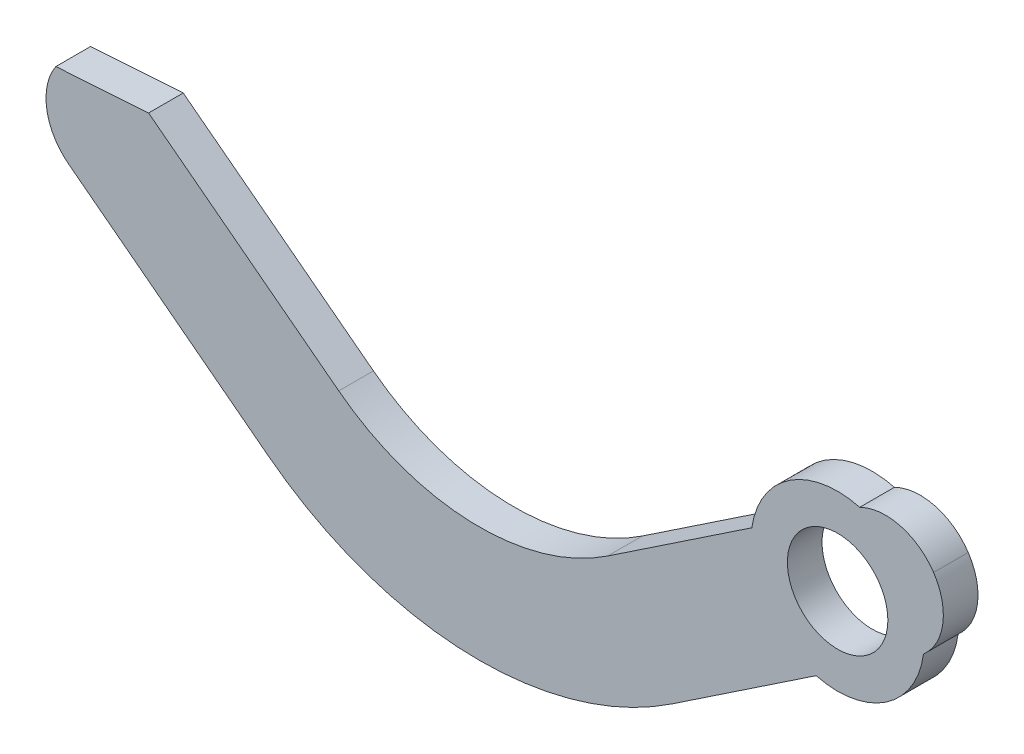
ISO-10303-21;
HEADER;
FILE_DESCRIPTION(('STEP AP214'),'2;1');
FILE_NAME('part.step','',(''),(''),'','','');
FILE_SCHEMA(('AUTOMOTIVE_DESIGN { 1 0 10303 214 1 1 1 1 }'));
ENDSEC;
DATA;
#1=APPLICATION_CONTEXT('core data for automotive mechanical design processes');
#2=APPLICATION_PROTOCOL_DEFINITION('international standard','automotive_design',2000,#1);
#3=PRODUCT_CONTEXT('',#1,'mechanical');
#4=PRODUCT('Part','Part','',(#3));
#5=PRODUCT_RELATED_PRODUCT_CATEGORY('part','',(#4));
#6=PRODUCT_DEFINITION_FORMATION('','',#4);
#7=PRODUCT_DEFINITION_CONTEXT('part definition',#1,'design');
#8=PRODUCT_DEFINITION('design','',#6,#7);
#9=PRODUCT_DEFINITION_SHAPE('','',#8);
#10=(LENGTH_UNIT() NAMED_UNIT(*) SI_UNIT(.MILLI.,.METRE.));
#11=(NAMED_UNIT(*) PLANE_ANGLE_UNIT() SI_UNIT($,.RADIAN.));
#12=(NAMED_UNIT(*) SI_UNIT($,.STERADIAN.) SOLID_ANGLE_UNIT());
#13=UNCERTAINTY_MEASURE_WITH_UNIT(LENGTH_MEASURE(1.E-05),#10,'distance_accuracy_value','');
#14=(GEOMETRIC_REPRESENTATION_CONTEXT(3) GLOBAL_UNCERTAINTY_ASSIGNED_CONTEXT((#13)) GLOBAL_UNIT_ASSIGNED_CONTEXT((#10,
#11,#12)) REPRESENTATION_CONTEXT('',''));
#15=CARTESIAN_POINT('',(0.,0.,0.));
#16=DIRECTION('',(0.,0.,1.));
#17=DIRECTION('',(1.,0.,0.));
#18=AXIS2_PLACEMENT_3D('',#15,#16,#17);
#19=CARTESIAN_POINT('',(-19.8730458213668,-25.3387015513863,3.));
#20=DIRECTION('',(-0.55631676865142,0.830970308084015,0.));
#21=DIRECTION('',(-0.830970308084015,-0.55631676865142,0.));
#22=AXIS2_PLACEMENT_3D('',#19,#20,#21);
#23=PLANE('',#22);
#24=DIRECTION('',(0.830970308084015,0.55631676865142,0.));
#25=VECTOR('',#24,1.);
#26=CARTESIAN_POINT('',(-19.8730458213668,-25.3387015513863,0.));
#27=LINE('',#26,#25);
#28=CARTESIAN_POINT('',(-19.8730458213668,-25.3387015513863,0.));
#29=VERTEX_POINT('',#28);
#30=CARTESIAN_POINT('',(-7.39180063472545,-16.9827760466733,0.));
#31=VERTEX_POINT('',#30);
#32=EDGE_CURVE('E150',#29,#31,#27,.T.);
#33=ORIENTED_EDGE('',*,*,#32,.T.);
#34=DIRECTION('',(0.,0.,1.));
#35=VECTOR('',#34,1.);
#36=CARTESIAN_POINT('',(-7.39180063472545,-16.9827760466733,0.));
#37=LINE('',#36,#35);
#38=CARTESIAN_POINT('',(-7.39180063472545,-16.9827760466733,3.));
#39=VERTEX_POINT('',#38);
#40=EDGE_CURVE('E195',#31,#39,#37,.T.);
#41=ORIENTED_EDGE('',*,*,#40,.T.);
#42=DIRECTION('',(0.830970308084015,0.55631676865142,0.));
#43=VECTOR('',#42,1.);
#44=CARTESIAN_POINT('',(-19.8730458213668,-25.3387015513863,3.));
#45=LINE('',#44,#43);
#46=CARTESIAN_POINT('',(-19.8730458213668,-25.3387015513863,3.));
#47=VERTEX_POINT('',#46);
#48=EDGE_CURVE('E165',#47,#39,#45,.T.);
#49=ORIENTED_EDGE('',*,*,#48,.F.);
#50=DIRECTION('',(0.,0.,-1.));
#51=VECTOR('',#50,1.);
#52=CARTESIAN_POINT('',(-19.8730458213668,-25.3387015513863,3.));
#53=LINE('',#52,#51);
#54=EDGE_CURVE('E149',#47,#29,#53,.T.);
#55=ORIENTED_EDGE('',*,*,#54,.T.);
#56=EDGE_LOOP('',(#33,#41,#49,#55));
#57=FACE_BOUND('',#56,.T.);
#58=ADVANCED_FACE('F33',(#57),#23,.F.);
#59=CARTESIAN_POINT('',(-25.436213507881,-17.0289984705462,3.));
#60=DIRECTION('',(-0.55631676865142,0.830970308084015,0.));
#61=DIRECTION('',(-0.830970308084015,-0.55631676865142,0.));
#62=AXIS2_PLACEMENT_3D('',#59,#60,#61);
#63=PLANE('',#62);
#64=DIRECTION('',(0.,0.,1.));
#65=VECTOR('',#64,1.);
#66=CARTESIAN_POINT('',(-12.9549683212397,-8.6730729658332,0.));
#67=LINE('',#66,#65);
#68=CARTESIAN_POINT('',(-12.9549683212396,-8.6730729658332,0.));
#69=VERTEX_POINT('',#68);
#70=CARTESIAN_POINT('',(-12.9549683212396,-8.6730729658332,3.));
#71=VERTEX_POINT('',#70);
#72=EDGE_CURVE('E215',#69,#71,#67,.T.);
#73=ORIENTED_EDGE('',*,*,#72,.F.);
#74=DIRECTION('',(0.830970308084015,0.55631676865142,0.));
#75=VECTOR('',#74,1.);
#76=CARTESIAN_POINT('',(-25.436213507881,-17.0289984705462,0.));
#77=LINE('',#76,#75);
#78=CARTESIAN_POINT('',(-25.436213507881,-17.0289984705462,0.));
#79=VERTEX_POINT('',#78);
#80=EDGE_CURVE('E153',#79,#69,#77,.T.);
#81=ORIENTED_EDGE('',*,*,#80,.F.);
#82=DIRECTION('',(0.,0.,-1.));
#83=VECTOR('',#82,1.);
#84=CARTESIAN_POINT('',(-25.436213507881,-17.0289984705462,3.));
#85=LINE('',#84,#83);
#86=CARTESIAN_POINT('',(-25.436213507881,-17.0289984705462,3.));
#87=VERTEX_POINT('',#86);
#88=EDGE_CURVE('E173',#87,#79,#85,.T.);
#89=ORIENTED_EDGE('',*,*,#88,.F.);
#90=DIRECTION('',(0.830970308084015,0.55631676865142,0.));
#91=VECTOR('',#90,1.);
#92=CARTESIAN_POINT('',(-25.436213507881,-17.0289984705462,3.));
#93=LINE('',#92,#91);
#94=EDGE_CURVE('E144',#87,#71,#93,.T.);
#95=ORIENTED_EDGE('',*,*,#94,.T.);
#96=EDGE_LOOP('',(#73,#81,#89,#95));
#97=FACE_BOUND('',#96,.T.);
#98=ADVANCED_FACE('F222',(#97),#63,.T.);
#99=CARTESIAN_POINT('',(-36.5625488809095,-0.409592308865937,3.));
#100=DIRECTION('',(0.,0.,-1.));
#101=DIRECTION('',(-1.,0.,0.));
#102=AXIS2_PLACEMENT_3D('',#99,#100,#101);
#103=CYLINDRICAL_SURFACE('',#102,20.);
#104=CARTESIAN_POINT('',(-36.5625488809095,-0.409592308865937,0.));
#105=DIRECTION('',(0.,0.,1.));
#106=DIRECTION('',(1.,0.,0.));
#107=AXIS2_PLACEMENT_3D('',#104,#105,#106);
#108=CIRCLE('',#107,20.);
#109=CARTESIAN_POINT('',(-48.7197165070033,-16.2905014551037,0.));
#110=VERTEX_POINT('',#109);
#111=EDGE_CURVE('E157',#110,#79,#108,.T.);
#112=ORIENTED_EDGE('',*,*,#111,.F.);
#113=DIRECTION('',(0.,0.,-1.));
#114=VECTOR('',#113,1.);
#115=CARTESIAN_POINT('',(-48.7197165070033,-16.2905014551037,3.));
#116=LINE('',#115,#114);
#117=CARTESIAN_POINT('',(-48.7197165070033,-16.2905014551037,3.));
#118=VERTEX_POINT('',#117);
#119=EDGE_CURVE('E171',#118,#110,#116,.T.);
#120=ORIENTED_EDGE('',*,*,#119,.F.);
#121=CARTESIAN_POINT('',(-36.5625488809095,-0.409592308865937,3.));
#122=DIRECTION('',(0.,0.,1.));
#123=DIRECTION('',(1.,0.,0.));
#124=AXIS2_PLACEMENT_3D('',#121,#122,#123);
#125=CIRCLE('',#124,20.);
#126=EDGE_CURVE('E139',#118,#87,#125,.T.);
#127=ORIENTED_EDGE('',*,*,#126,.T.);
#128=ORIENTED_EDGE('',*,*,#88,.T.);
#129=EDGE_LOOP('',(#112,#120,#127,#128));
#130=FACE_BOUND('',#129,.T.);
#131=ADVANCED_FACE('F226',(#130),#103,.F.);
#132=CARTESIAN_POINT('',(-70.,0.,3.));
#133=DIRECTION('',(0.607858381304685,0.79404545731189,0.));
#134=DIRECTION('',(-0.79404545731189,0.607858381304685,0.));
#135=AXIS2_PLACEMENT_3D('',#132,#133,#134);
#136=PLANE('',#135);
#137=DIRECTION('',(0.,0.,1.));
#138=VECTOR('',#137,1.);
#139=CARTESIAN_POINT('',(-65.1864125617219,-3.68490171633965,-7.));
#140=LINE('',#139,#138);
#141=CARTESIAN_POINT('',(-65.1864125617219,-3.68490171633965,0.));
#142=VERTEX_POINT('',#141);
#143=CARTESIAN_POINT('',(-65.1864125617219,-3.68490171633965,3.));
#144=VERTEX_POINT('',#143);
#145=EDGE_CURVE('E122',#142,#144,#140,.T.);
#146=ORIENTED_EDGE('',*,*,#145,.T.);
#147=DIRECTION('',(0.79404545731189,-0.607858381304685,0.));
#148=VECTOR('',#147,1.);
#149=CARTESIAN_POINT('',(-70.,0.,3.));
#150=LINE('',#149,#148);
#151=EDGE_CURVE('E130',#144,#118,#150,.T.);
#152=ORIENTED_EDGE('',*,*,#151,.T.);
#153=ORIENTED_EDGE('',*,*,#119,.T.);
#154=DIRECTION('',(0.79404545731189,-0.607858381304685,0.));
#155=VECTOR('',#154,1.);
#156=CARTESIAN_POINT('',(-70.,0.,0.));
#157=LINE('',#156,#155);
#158=EDGE_CURVE('E132',#142,#110,#157,.T.);
#159=ORIENTED_EDGE('',*,*,#158,.F.);
#160=EDGE_LOOP('',(#146,#152,#153,#159));
#161=FACE_BOUND('',#160,.T.);
#162=ADVANCED_FACE('F128',(#161),#136,.T.);
#163=CARTESIAN_POINT('',(-76.0785838130469,-7.94045457311891,3.));
#164=DIRECTION('',(0.607858381304685,0.79404545731189,0.));
#165=DIRECTION('',(-0.79404545731189,0.607858381304685,0.));
#166=AXIS2_PLACEMENT_3D('',#163,#164,#165);
#167=PLANE('',#166);
#168=DIRECTION('',(0.79404545731189,-0.607858381304685,0.));
#169=VECTOR('',#168,1.);
#170=CARTESIAN_POINT('',(-76.0785838130469,-7.94045457311891,3.));
#171=LINE('',#170,#169);
#172=CARTESIAN_POINT('',(-72.1083565264874,-10.9797464796423,3.));
#173=VERTEX_POINT('',#172);
#174=CARTESIAN_POINT('',(-54.7983003200502,-24.2309560282225,3.));
#175=VERTEX_POINT('',#174);
#176=EDGE_CURVE('E140',#173,#175,#171,.T.);
#177=ORIENTED_EDGE('',*,*,#176,.F.);
#178=DIRECTION('',(0.,0.,-1.));
#179=VECTOR('',#178,1.);
#180=CARTESIAN_POINT('',(-72.1083565264874,-10.9797464796423,0.));
#181=LINE('',#180,#179);
#182=CARTESIAN_POINT('',(-72.1083565264874,-10.9797464796423,0.));
#183=VERTEX_POINT('',#182);
#184=EDGE_CURVE('E175',#173,#183,#181,.T.);
#185=ORIENTED_EDGE('',*,*,#184,.T.);
#186=DIRECTION('',(0.79404545731189,-0.607858381304685,0.));
#187=VECTOR('',#186,1.);
#188=CARTESIAN_POINT('',(-76.0785838130469,-7.94045457311891,0.));
#189=LINE('',#188,#187);
#190=CARTESIAN_POINT('',(-54.7983003200502,-24.2309560282225,0.));
#191=VERTEX_POINT('',#190);
#192=EDGE_CURVE('E161',#183,#191,#189,.T.);
#193=ORIENTED_EDGE('',*,*,#192,.T.);
#194=DIRECTION('',(0.,0.,-1.));
#195=VECTOR('',#194,1.);
#196=CARTESIAN_POINT('',(-54.7983003200502,-24.2309560282225,3.));
#197=LINE('',#196,#195);
#198=EDGE_CURVE('E168',#175,#191,#197,.T.);
#199=ORIENTED_EDGE('',*,*,#198,.F.);
#200=EDGE_LOOP('',(#177,#185,#193,#199));
#201=FACE_BOUND('',#200,.T.);
#202=ADVANCED_FACE('F237',(#201),#167,.F.);
#203=CARTESIAN_POINT('',(-36.5625488809095,-0.409592308865937,3.));
#204=DIRECTION('',(0.,0.,-1.));
#205=DIRECTION('',(-1.,0.,0.));
#206=AXIS2_PLACEMENT_3D('',#203,#204,#205);
#207=CYLINDRICAL_SURFACE('',#206,30.);
#208=CARTESIAN_POINT('',(-36.5625488809095,-0.409592308865937,0.));
#209=DIRECTION('',(0.,0.,1.));
#210=DIRECTION('',(1.,0.,0.));
#211=AXIS2_PLACEMENT_3D('',#208,#209,#210);
#212=CIRCLE('',#211,30.);
#213=EDGE_CURVE('E163',#191,#29,#212,.T.);
#214=ORIENTED_EDGE('',*,*,#213,.T.);
#215=ORIENTED_EDGE('',*,*,#54,.F.);
#216=CARTESIAN_POINT('',(-36.5625488809095,-0.409592308865937,3.));
#217=DIRECTION('',(0.,0.,1.));
#218=DIRECTION('',(1.,0.,0.));
#219=AXIS2_PLACEMENT_3D('',#216,#217,#218);
#220=CIRCLE('',#219,30.);
#221=EDGE_CURVE('E142',#175,#47,#220,.T.);
#222=ORIENTED_EDGE('',*,*,#221,.F.);
#223=ORIENTED_EDGE('',*,*,#198,.T.);
#224=EDGE_LOOP('',(#214,#215,#222,#223));
#225=FACE_BOUND('',#224,.T.);
#226=ADVANCED_FACE('F243',(#225),#207,.T.);
#227=CARTESIAN_POINT('',(-36.5625488809095,-0.409592308865937,3.));
#228=DIRECTION('',(0.,0.,1.));
#229=DIRECTION('',(1.,0.,0.));
#230=AXIS2_PLACEMENT_3D('',#227,#228,#229);
#231=PLANE('',#230);
#232=DIRECTION('',(0.997799780917048,0.0662993001613935,0.));
#233=VECTOR('',#232,1.);
#234=CARTESIAN_POINT('',(-73.2300101445352,-4.21936253775842,3.));
#235=LINE('',#234,#233);
#236=CARTESIAN_POINT('',(-73.217609821005,-4.2185385921257,3.));
#237=VERTEX_POINT('',#236);
#238=EDGE_CURVE('E119',#237,#144,#235,.T.);
#239=ORIENTED_EDGE('',*,*,#238,.F.);
#240=CARTESIAN_POINT('',(-69.069064619964,-7.00951919308288,3.));
#241=DIRECTION('',(0.,0.,1.));
#242=DIRECTION('',(1.,0.,0.));
#243=AXIS2_PLACEMENT_3D('',#240,#241,#242);
#244=CIRCLE('',#243,5.);
#245=EDGE_CURVE('E191',#237,#173,#244,.T.);
#246=ORIENTED_EDGE('',*,*,#245,.T.);
#247=ORIENTED_EDGE('',*,*,#176,.T.);
#248=ORIENTED_EDGE('',*,*,#221,.T.);
#249=ORIENTED_EDGE('',*,*,#48,.T.);
#250=CARTESIAN_POINT('',(-5.52811923758305,-9.71801922693427,3.));
#251=DIRECTION('',(0.,0.,1.));
#252=DIRECTION('',(1.,0.,0.));
#253=AXIS2_PLACEMENT_3D('',#250,#251,#252);
#254=CIRCLE('',#253,7.5);
#255=CARTESIAN_POINT('',(1.90585590793962,-10.7110013696495,3.));
#256=VERTEX_POINT('',#255);
#257=EDGE_CURVE('E55',#39,#256,#254,.T.);
#258=ORIENTED_EDGE('',*,*,#257,.T.);
#259=CARTESIAN_POINT('',(-1.37326769716297,-6.93643538367717,3.));
#260=DIRECTION('',(0.,0.,1.));
#261=DIRECTION('',(1.,0.,0.));
#262=AXIS2_PLACEMENT_3D('',#259,#260,#261);
#263=CIRCLE('',#262,5.);
#264=CARTESIAN_POINT('',(2.7815838432571,-4.15485154042008,3.));
#265=VERTEX_POINT('',#264);
#266=EDGE_CURVE('E189',#256,#265,#263,.T.);
#267=ORIENTED_EDGE('',*,*,#266,.T.);
#268=CARTESIAN_POINT('',(-1.37326769716297,-6.93643538367718,3.));
#269=DIRECTION('',(0.,0.,1.));
#270=DIRECTION('',(1.,0.,0.));
#271=AXIS2_PLACEMENT_3D('',#268,#269,#270);
#272=CIRCLE('',#271,5.);
#273=CARTESIAN_POINT('',(-3.61367841716054,-2.46647343689061,3.));
#274=VERTEX_POINT('',#273);
#275=EDGE_CURVE('E186',#265,#274,#272,.T.);
#276=ORIENTED_EDGE('',*,*,#275,.T.);
#277=EDGE_CURVE('E201',#274,#71,#254,.T.);
#278=ORIENTED_EDGE('',*,*,#277,.T.);
#279=ORIENTED_EDGE('',*,*,#94,.F.);
#280=ORIENTED_EDGE('',*,*,#126,.F.);
#281=ORIENTED_EDGE('',*,*,#151,.F.);
#282=EDGE_LOOP('',(#239,#246,#247,#248,#249,#258,#267,#276,#278,#279,#280,#281));
#283=FACE_BOUND('',#282,.T.);
#284=CARTESIAN_POINT('',(-5.52811923758305,-9.71801922693427,3.));
#285=DIRECTION('',(0.,0.,1.));
#286=DIRECTION('',(1.,0.,0.));
#287=AXIS2_PLACEMENT_3D('',#284,#285,#286);
#288=CIRCLE('',#287,4.35);
#289=CARTESIAN_POINT('',(-1.17811923758305,-9.71801922693427,3.));
#290=VERTEX_POINT('',#289);
#291=EDGE_CURVE('E198',#290,#290,#288,.T.);
#292=ORIENTED_EDGE('',*,*,#291,.F.);
#293=EDGE_LOOP('',(#292));
#294=FACE_BOUND('',#293,.T.);
#295=ADVANCED_FACE('F135',(#283,#294),#231,.T.);
#296=CARTESIAN_POINT('',(-36.5625488809095,-0.409592308865937,0.));
#297=DIRECTION('',(0.,0.,1.));
#298=DIRECTION('',(1.,0.,0.));
#299=AXIS2_PLACEMENT_3D('',#296,#297,#298);
#300=PLANE('',#299);
#301=CARTESIAN_POINT('',(-5.52811923758305,-9.71801922693427,0.));
#302=DIRECTION('',(0.,0.,1.));
#303=DIRECTION('',(1.,0.,0.));
#304=AXIS2_PLACEMENT_3D('',#301,#302,#303);
#305=CIRCLE('',#304,4.35);
#306=CARTESIAN_POINT('',(-1.17811923758305,-9.71801922693427,0.));
#307=VERTEX_POINT('',#306);
#308=EDGE_CURVE('E196',#307,#307,#305,.T.);
#309=ORIENTED_EDGE('',*,*,#308,.T.);
#310=EDGE_LOOP('',(#309));
#311=FACE_BOUND('',#310,.T.);
#312=CARTESIAN_POINT('',(-69.069064619964,-7.00951919308288,0.));
#313=DIRECTION('',(0.,0.,1.));
#314=DIRECTION('',(1.,0.,0.));
#315=AXIS2_PLACEMENT_3D('',#312,#313,#314);
#316=CIRCLE('',#315,5.);
#317=CARTESIAN_POINT('',(-73.217609821005,-4.21853859212569,0.));
#318=VERTEX_POINT('',#317);
#319=EDGE_CURVE('E183',#183,#318,#316,.F.);
#320=ORIENTED_EDGE('',*,*,#319,.T.);
#321=DIRECTION('',(0.997799780917048,0.0662993001613935,0.));
#322=VECTOR('',#321,1.);
#323=CARTESIAN_POINT('',(-36.471694913646,-1.77693809396869,0.));
#324=LINE('',#323,#322);
#325=EDGE_CURVE('E47',#318,#142,#324,.T.);
#326=ORIENTED_EDGE('',*,*,#325,.T.);
#327=ORIENTED_EDGE('',*,*,#158,.T.);
#328=ORIENTED_EDGE('',*,*,#111,.T.);
#329=ORIENTED_EDGE('',*,*,#80,.T.);
#330=CARTESIAN_POINT('',(-5.52811923758305,-9.71801922693427,0.));
#331=DIRECTION('',(0.,0.,1.));
#332=DIRECTION('',(1.,0.,0.));
#333=AXIS2_PLACEMENT_3D('',#330,#331,#332);
#334=CIRCLE('',#333,7.5);
#335=CARTESIAN_POINT('',(-3.61367841716054,-2.46647343689061,0.));
#336=VERTEX_POINT('',#335);
#337=EDGE_CURVE('E209',#336,#69,#334,.T.);
#338=ORIENTED_EDGE('',*,*,#337,.F.);
#339=CARTESIAN_POINT('',(-1.37326769716297,-6.93643538367718,0.));
#340=DIRECTION('',(0.,0.,1.));
#341=DIRECTION('',(1.,0.,0.));
#342=AXIS2_PLACEMENT_3D('',#339,#340,#341);
#343=CIRCLE('',#342,5.);
#344=CARTESIAN_POINT('',(2.7815838432571,-4.15485154042008,0.));
#345=VERTEX_POINT('',#344);
#346=EDGE_CURVE('E178',#336,#345,#343,.F.);
#347=ORIENTED_EDGE('',*,*,#346,.T.);
#348=CARTESIAN_POINT('',(-1.37326769716297,-6.93643538367717,0.));
#349=DIRECTION('',(0.,0.,1.));
#350=DIRECTION('',(1.,0.,0.));
#351=AXIS2_PLACEMENT_3D('',#348,#349,#350);
#352=CIRCLE('',#351,5.);
#353=CARTESIAN_POINT('',(1.90585590793962,-10.7110013696495,0.));
#354=VERTEX_POINT('',#353);
#355=EDGE_CURVE('E180',#345,#354,#352,.F.);
#356=ORIENTED_EDGE('',*,*,#355,.T.);
#357=EDGE_CURVE('E211',#31,#354,#334,.T.);
#358=ORIENTED_EDGE('',*,*,#357,.F.);
#359=ORIENTED_EDGE('',*,*,#32,.F.);
#360=ORIENTED_EDGE('',*,*,#213,.F.);
#361=ORIENTED_EDGE('',*,*,#192,.F.);
#362=EDGE_LOOP('',(#320,#326,#327,#328,#329,#338,#347,#356,#358,#359,#360,#361));
#363=FACE_BOUND('',#362,.T.);
#364=ADVANCED_FACE('F228',(#311,#363),#300,.F.);
#365=CARTESIAN_POINT('',(-69.069064619964,-7.00951919308288,3.));
#366=DIRECTION('',(0.,0.,1.));
#367=DIRECTION('',(1.,0.,0.));
#368=AXIS2_PLACEMENT_3D('',#365,#366,#367);
#369=CYLINDRICAL_SURFACE('',#368,5.);
#370=DIRECTION('',(0.,0.,1.));
#371=VECTOR('',#370,1.);
#372=CARTESIAN_POINT('',(-73.217609821005,-4.2185385921257,3.));
#373=LINE('',#372,#371);
#374=EDGE_CURVE('E11',#318,#237,#373,.T.);
#375=ORIENTED_EDGE('',*,*,#374,.F.);
#376=ORIENTED_EDGE('',*,*,#319,.F.);
#377=ORIENTED_EDGE('',*,*,#184,.F.);
#378=ORIENTED_EDGE('',*,*,#245,.F.);
#379=EDGE_LOOP('',(#375,#376,#377,#378));
#380=FACE_BOUND('',#379,.T.);
#381=ADVANCED_FACE('F234',(#380),#369,.T.);
#382=CARTESIAN_POINT('',(-1.37326769716297,-6.93643538367718,3.));
#383=DIRECTION('',(0.,0.,-1.));
#384=DIRECTION('',(-1.,0.,0.));
#385=AXIS2_PLACEMENT_3D('',#382,#383,#384);
#386=CYLINDRICAL_SURFACE('',#385,5.);
#387=DIRECTION('',(0.,0.,1.));
#388=VECTOR('',#387,1.);
#389=CARTESIAN_POINT('',(-3.61367841716054,-2.46647343689061,1.5));
#390=LINE('',#389,#388);
#391=EDGE_CURVE('E210',#274,#336,#390,.F.);
#392=ORIENTED_EDGE('',*,*,#391,.F.);
#393=ORIENTED_EDGE('',*,*,#275,.F.);
#394=DIRECTION('',(0.,0.,-1.));
#395=VECTOR('',#394,1.);
#396=CARTESIAN_POINT('',(2.7815838432571,-4.15485154042008,3.));
#397=LINE('',#396,#395);
#398=EDGE_CURVE('E154',#345,#265,#397,.F.);
#399=ORIENTED_EDGE('',*,*,#398,.F.);
#400=ORIENTED_EDGE('',*,*,#346,.F.);
#401=EDGE_LOOP('',(#392,#393,#399,#400));
#402=FACE_BOUND('',#401,.T.);
#403=ADVANCED_FACE('F35',(#402),#386,.T.);
#404=CARTESIAN_POINT('',(-1.37326769716297,-6.93643538367717,3.));
#405=DIRECTION('',(0.,0.,1.));
#406=DIRECTION('',(1.,0.,0.));
#407=AXIS2_PLACEMENT_3D('',#404,#405,#406);
#408=CYLINDRICAL_SURFACE('',#407,5.);
#409=DIRECTION('',(0.,0.,1.));
#410=VECTOR('',#409,1.);
#411=CARTESIAN_POINT('',(1.90585590793962,-10.7110013696495,1.5));
#412=LINE('',#411,#410);
#413=EDGE_CURVE('E41',#354,#256,#412,.T.);
#414=ORIENTED_EDGE('',*,*,#413,.F.);
#415=ORIENTED_EDGE('',*,*,#355,.F.);
#416=ORIENTED_EDGE('',*,*,#398,.T.);
#417=ORIENTED_EDGE('',*,*,#266,.F.);
#418=EDGE_LOOP('',(#414,#415,#416,#417));
#419=FACE_BOUND('',#418,.T.);
#420=ADVANCED_FACE('F254',(#419),#408,.T.);
#421=CARTESIAN_POINT('',(-5.52811923758305,-9.71801922693427,0.));
#422=DIRECTION('',(0.,0.,1.));
#423=DIRECTION('',(1.,0.,0.));
#424=AXIS2_PLACEMENT_3D('',#421,#422,#423);
#425=CYLINDRICAL_SURFACE('',#424,7.5);
#426=ORIENTED_EDGE('',*,*,#40,.F.);
#427=ORIENTED_EDGE('',*,*,#357,.T.);
#428=ORIENTED_EDGE('',*,*,#413,.T.);
#429=ORIENTED_EDGE('',*,*,#257,.F.);
#430=EDGE_LOOP('',(#426,#427,#428,#429));
#431=FACE_BOUND('',#430,.T.);
#432=ADVANCED_FACE('F248',(#431),#425,.T.);
#433=ORIENTED_EDGE('',*,*,#337,.T.);
#434=ORIENTED_EDGE('',*,*,#72,.T.);
#435=ORIENTED_EDGE('',*,*,#277,.F.);
#436=ORIENTED_EDGE('',*,*,#391,.T.);
#437=EDGE_LOOP('',(#433,#434,#435,#436));
#438=FACE_BOUND('',#437,.T.);
#439=ADVANCED_FACE('F260',(#438),#425,.T.);
#440=CARTESIAN_POINT('',(-5.52811923758305,-9.71801922693427,-3.));
#441=DIRECTION('',(0.,0.,1.));
#442=DIRECTION('',(1.,0.,0.));
#443=AXIS2_PLACEMENT_3D('',#440,#441,#442);
#444=CYLINDRICAL_SURFACE('',#443,4.35);
#445=ORIENTED_EDGE('',*,*,#291,.T.);
#446=EDGE_LOOP('',(#445));
#447=FACE_BOUND('',#446,.T.);
#448=ORIENTED_EDGE('',*,*,#308,.F.);
#449=EDGE_LOOP('',(#448));
#450=FACE_BOUND('',#449,.T.);
#451=ADVANCED_FACE('F262',(#447,#450),#444,.F.);
#452=CARTESIAN_POINT('',(-73.2300101445352,-4.21936253775842,-7.));
#453=DIRECTION('',(0.0662993001613935,-0.997799780917048,0.));
#454=DIRECTION('',(0.997799780917048,0.0662993001613935,0.));
#455=AXIS2_PLACEMENT_3D('',#452,#453,#454);
#456=PLANE('',#455);
#457=ORIENTED_EDGE('',*,*,#374,.T.);
#458=ORIENTED_EDGE('',*,*,#238,.T.);
#459=ORIENTED_EDGE('',*,*,#145,.F.);
#460=ORIENTED_EDGE('',*,*,#325,.F.);
#461=EDGE_LOOP('',(#457,#458,#459,#460));
#462=FACE_BOUND('',#461,.T.);
#463=ADVANCED_FACE('F121',(#462),#456,.F.);
#464=CLOSED_SHELL('',(#58,#98,#131,#162,#202,#226,#295,#364,#381,#403,#420,#432,#439,#451,#463));
#465=MANIFOLD_SOLID_BREP('B2',#464);
#466=ADVANCED_BREP_SHAPE_REPRESENTATION('',(#18,#465),#14);
#467=SHAPE_DEFINITION_REPRESENTATION(#9,#466);
ENDSEC;
END-ISO-10303-21;
